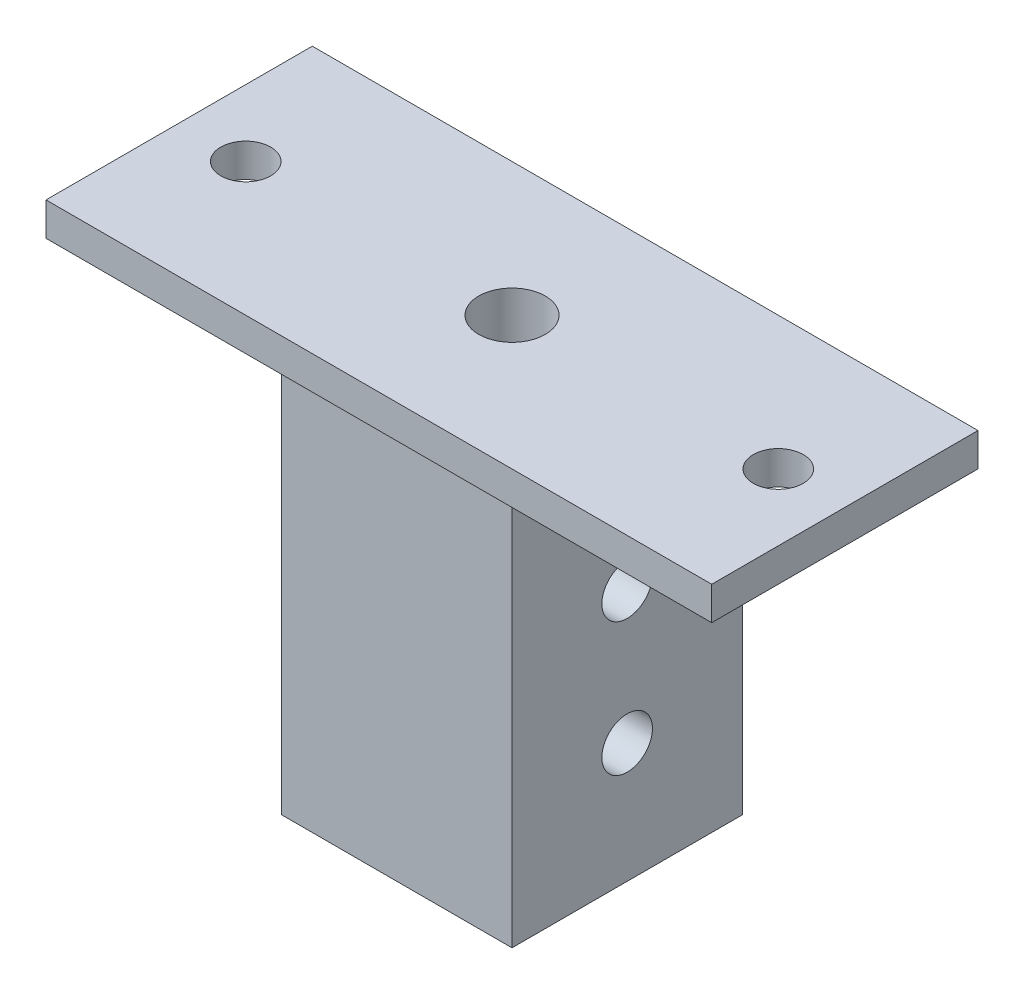
ISO-10303-21;
HEADER;
FILE_DESCRIPTION(('STEP AP214'),'2;1');
FILE_NAME('part.step','',(''),(''),'','','');
FILE_SCHEMA(('AUTOMOTIVE_DESIGN { 1 0 10303 214 1 1 1 1 }'));
ENDSEC;
DATA;
#1=APPLICATION_CONTEXT('core data for automotive mechanical design processes');
#2=APPLICATION_PROTOCOL_DEFINITION('international standard','automotive_design',2000,#1);
#3=PRODUCT_CONTEXT('',#1,'mechanical');
#4=PRODUCT('Part','Part','',(#3));
#5=PRODUCT_RELATED_PRODUCT_CATEGORY('part','',(#4));
#6=PRODUCT_DEFINITION_FORMATION('','',#4);
#7=PRODUCT_DEFINITION_CONTEXT('part definition',#1,'design');
#8=PRODUCT_DEFINITION('design','',#6,#7);
#9=PRODUCT_DEFINITION_SHAPE('','',#8);
#10=(LENGTH_UNIT() NAMED_UNIT(*) SI_UNIT(.MILLI.,.METRE.));
#11=(NAMED_UNIT(*) PLANE_ANGLE_UNIT() SI_UNIT($,.RADIAN.));
#12=(NAMED_UNIT(*) SI_UNIT($,.STERADIAN.) SOLID_ANGLE_UNIT());
#13=UNCERTAINTY_MEASURE_WITH_UNIT(LENGTH_MEASURE(1.E-05),#10,'distance_accuracy_value','');
#14=(GEOMETRIC_REPRESENTATION_CONTEXT(3) GLOBAL_UNCERTAINTY_ASSIGNED_CONTEXT((#13)) GLOBAL_UNIT_ASSIGNED_CONTEXT((#10,
#11,#12)) REPRESENTATION_CONTEXT('',''));
#15=CARTESIAN_POINT('',(0.,0.,0.));
#16=DIRECTION('',(0.,0.,1.));
#17=DIRECTION('',(1.,0.,0.));
#18=AXIS2_PLACEMENT_3D('',#15,#16,#17);
#19=CARTESIAN_POINT('',(0.,26.035,0.));
#20=DIRECTION('',(0.,1.,0.));
#21=DIRECTION('',(0.,0.,1.));
#22=AXIS2_PLACEMENT_3D('',#19,#20,#21);
#23=PLANE('',#22);
#24=DIRECTION('',(1.,0.,0.));
#25=VECTOR('',#24,1.);
#26=CARTESIAN_POINT('',(-14.4145,26.035,1.48106178129071));
#27=LINE('',#26,#25);
#28=CARTESIAN_POINT('',(-2.80839473721199,26.035,1.48106178129071));
#29=VERTEX_POINT('',#28);
#30=CARTESIAN_POINT('',(2.80839473721199,26.035,1.48106178129071));
#31=VERTEX_POINT('',#30);
#32=EDGE_CURVE('E11',#29,#31,#27,.T.);
#33=ORIENTED_EDGE('',*,*,#32,.F.);
#34=CARTESIAN_POINT('',(0.,26.035,0.));
#35=DIRECTION('',(0.,1.,0.));
#36=DIRECTION('',(0.,0.,1.));
#37=AXIS2_PLACEMENT_3D('',#34,#35,#36);
#38=CIRCLE('',#37,3.175);
#39=EDGE_CURVE('E139',#29,#31,#38,.T.);
#40=ORIENTED_EDGE('',*,*,#39,.T.);
#41=EDGE_LOOP('',(#33,#40));
#42=FACE_BOUND('',#41,.T.);
#43=ADVANCED_FACE('F37',(#42),#23,.T.);
#44=CARTESIAN_POINT('',(10.9855,38.1,-10.9855));
#45=DIRECTION('',(-1.,0.,0.));
#46=DIRECTION('',(0.,0.,1.));
#47=AXIS2_PLACEMENT_3D('',#44,#45,#46);
#48=PLANE('',#47);
#49=CARTESIAN_POINT('',(10.9855,24.13,0.));
#50=DIRECTION('',(1.,0.,0.));
#51=DIRECTION('',(0.,0.,-1.));
#52=AXIS2_PLACEMENT_3D('',#49,#50,#51);
#53=CIRCLE('',#52,2.413);
#54=CARTESIAN_POINT('',(10.9855,24.13,-2.413));
#55=VERTEX_POINT('',#54);
#56=EDGE_CURVE('E556',#55,#55,#53,.T.);
#57=ORIENTED_EDGE('',*,*,#56,.F.);
#58=EDGE_LOOP('',(#57));
#59=FACE_BOUND('',#58,.T.);
#60=CARTESIAN_POINT('',(10.9855,11.43,0.));
#61=DIRECTION('',(1.,0.,0.));
#62=DIRECTION('',(0.,0.,-1.));
#63=AXIS2_PLACEMENT_3D('',#60,#61,#62);
#64=CIRCLE('',#63,2.413);
#65=CARTESIAN_POINT('',(10.9855,11.43,-2.413));
#66=VERTEX_POINT('',#65);
#67=EDGE_CURVE('E357',#66,#66,#64,.T.);
#68=ORIENTED_EDGE('',*,*,#67,.F.);
#69=EDGE_LOOP('',(#68));
#70=FACE_BOUND('',#69,.T.);
#71=DIRECTION('',(0.,-1.,0.));
#72=VECTOR('',#71,1.);
#73=CARTESIAN_POINT('',(10.9855,38.1,-10.9855));
#74=LINE('',#73,#72);
#75=CARTESIAN_POINT('',(10.9855,36.83,-10.9855));
#76=VERTEX_POINT('',#75);
#77=CARTESIAN_POINT('',(10.9855,0.,-10.9855));
#78=VERTEX_POINT('',#77);
#79=EDGE_CURVE('E213',#76,#78,#74,.T.);
#80=ORIENTED_EDGE('',*,*,#79,.F.);
#81=DIRECTION('',(0.,0.,-1.));
#82=VECTOR('',#81,1.);
#83=CARTESIAN_POINT('',(10.9855,36.83,10.9855));
#84=LINE('',#83,#82);
#85=CARTESIAN_POINT('',(10.9855,36.83,10.9855));
#86=VERTEX_POINT('',#85);
#87=EDGE_CURVE('E60',#76,#86,#84,.F.);
#88=ORIENTED_EDGE('',*,*,#87,.T.);
#89=DIRECTION('',(0.,-1.,0.));
#90=VECTOR('',#89,1.);
#91=CARTESIAN_POINT('',(10.9855,38.1,10.9855));
#92=LINE('',#91,#90);
#93=CARTESIAN_POINT('',(10.9855,0.,10.9855));
#94=VERTEX_POINT('',#93);
#95=EDGE_CURVE('E207',#86,#94,#92,.T.);
#96=ORIENTED_EDGE('',*,*,#95,.T.);
#97=DIRECTION('',(0.,0.,-1.));
#98=VECTOR('',#97,1.);
#99=CARTESIAN_POINT('',(10.9855,0.,-10.9855));
#100=LINE('',#99,#98);
#101=EDGE_CURVE('E195',#94,#78,#100,.T.);
#102=ORIENTED_EDGE('',*,*,#101,.T.);
#103=EDGE_LOOP('',(#80,#88,#96,#102));
#104=FACE_BOUND('',#103,.T.);
#105=ADVANCED_FACE('F259',(#59,#70,#104),#48,.F.);
#106=CARTESIAN_POINT('',(-10.9855,38.1,-10.9855));
#107=DIRECTION('',(0.,0.,1.));
#108=DIRECTION('',(1.,0.,0.));
#109=AXIS2_PLACEMENT_3D('',#106,#107,#108);
#110=PLANE('',#109);
#111=DIRECTION('',(0.,-1.,0.));
#112=VECTOR('',#111,1.);
#113=CARTESIAN_POINT('',(-10.9855,38.1,-10.9855));
#114=LINE('',#113,#112);
#115=CARTESIAN_POINT('',(-10.9855,36.83,-10.9855));
#116=VERTEX_POINT('',#115);
#117=CARTESIAN_POINT('',(-10.9855,0.,-10.9855));
#118=VERTEX_POINT('',#117);
#119=EDGE_CURVE('E211',#116,#118,#114,.T.);
#120=ORIENTED_EDGE('',*,*,#119,.F.);
#121=DIRECTION('',(-1.,0.,0.));
#122=VECTOR('',#121,1.);
#123=CARTESIAN_POINT('',(10.9855,36.83,-10.9855));
#124=LINE('',#123,#122);
#125=EDGE_CURVE('E224',#116,#76,#124,.F.);
#126=ORIENTED_EDGE('',*,*,#125,.T.);
#127=ORIENTED_EDGE('',*,*,#79,.T.);
#128=DIRECTION('',(-1.,0.,0.));
#129=VECTOR('',#128,1.);
#130=CARTESIAN_POINT('',(-10.9855,0.,-10.9855));
#131=LINE('',#130,#129);
#132=EDGE_CURVE('E198',#78,#118,#131,.T.);
#133=ORIENTED_EDGE('',*,*,#132,.T.);
#134=EDGE_LOOP('',(#120,#126,#127,#133));
#135=FACE_BOUND('',#134,.T.);
#136=ADVANCED_FACE('F261',(#135),#110,.F.);
#137=CARTESIAN_POINT('',(-10.9855,38.1,-10.9855));
#138=DIRECTION('',(1.,0.,0.));
#139=DIRECTION('',(0.,0.,-1.));
#140=AXIS2_PLACEMENT_3D('',#137,#138,#139);
#141=PLANE('',#140);
#142=CARTESIAN_POINT('',(-10.9855,24.13,0.));
#143=DIRECTION('',(1.,0.,0.));
#144=DIRECTION('',(0.,0.,-1.));
#145=AXIS2_PLACEMENT_3D('',#142,#143,#144);
#146=CIRCLE('',#145,2.413);
#147=CARTESIAN_POINT('',(-10.9855,24.13,-2.413));
#148=VERTEX_POINT('',#147);
#149=EDGE_CURVE('E140',#148,#148,#146,.T.);
#150=ORIENTED_EDGE('',*,*,#149,.T.);
#151=EDGE_LOOP('',(#150));
#152=FACE_BOUND('',#151,.T.);
#153=CARTESIAN_POINT('',(-10.9855,11.43,0.));
#154=DIRECTION('',(1.,0.,0.));
#155=DIRECTION('',(0.,0.,-1.));
#156=AXIS2_PLACEMENT_3D('',#153,#154,#155);
#157=CIRCLE('',#156,2.413);
#158=CARTESIAN_POINT('',(-10.9855,11.43,-2.413));
#159=VERTEX_POINT('',#158);
#160=EDGE_CURVE('E41',#159,#159,#157,.T.);
#161=ORIENTED_EDGE('',*,*,#160,.T.);
#162=EDGE_LOOP('',(#161));
#163=FACE_BOUND('',#162,.T.);
#164=DIRECTION('',(0.,-1.,0.));
#165=VECTOR('',#164,1.);
#166=CARTESIAN_POINT('',(-10.9855,38.1,10.9855));
#167=LINE('',#166,#165);
#168=CARTESIAN_POINT('',(-10.9855,36.83,10.9855));
#169=VERTEX_POINT('',#168);
#170=CARTESIAN_POINT('',(-10.9855,0.,10.9855));
#171=VERTEX_POINT('',#170);
#172=EDGE_CURVE('E209',#169,#171,#167,.T.);
#173=ORIENTED_EDGE('',*,*,#172,.F.);
#174=DIRECTION('',(0.,0.,1.));
#175=VECTOR('',#174,1.);
#176=CARTESIAN_POINT('',(-10.9855,36.83,-10.9855));
#177=LINE('',#176,#175);
#178=EDGE_CURVE('E227',#169,#116,#177,.F.);
#179=ORIENTED_EDGE('',*,*,#178,.T.);
#180=ORIENTED_EDGE('',*,*,#119,.T.);
#181=DIRECTION('',(0.,0.,1.));
#182=VECTOR('',#181,1.);
#183=CARTESIAN_POINT('',(-10.9855,0.,-10.9855));
#184=LINE('',#183,#182);
#185=EDGE_CURVE('E201',#118,#171,#184,.T.);
#186=ORIENTED_EDGE('',*,*,#185,.T.);
#187=EDGE_LOOP('',(#173,#179,#180,#186));
#188=FACE_BOUND('',#187,.T.);
#189=ADVANCED_FACE('F251',(#152,#163,#188),#141,.F.);
#190=CARTESIAN_POINT('',(-10.9855,38.1,10.9855));
#191=DIRECTION('',(0.,0.,-1.));
#192=DIRECTION('',(-1.,0.,0.));
#193=AXIS2_PLACEMENT_3D('',#190,#191,#192);
#194=PLANE('',#193);
#195=ORIENTED_EDGE('',*,*,#95,.F.);
#196=DIRECTION('',(1.,0.,0.));
#197=VECTOR('',#196,1.);
#198=CARTESIAN_POINT('',(-10.9855,36.83,10.9855));
#199=LINE('',#198,#197);
#200=EDGE_CURVE('E229',#86,#169,#199,.F.);
#201=ORIENTED_EDGE('',*,*,#200,.T.);
#202=ORIENTED_EDGE('',*,*,#172,.T.);
#203=DIRECTION('',(1.,0.,0.));
#204=VECTOR('',#203,1.);
#205=CARTESIAN_POINT('',(-10.9855,0.,10.9855));
#206=LINE('',#205,#204);
#207=EDGE_CURVE('E204',#171,#94,#206,.T.);
#208=ORIENTED_EDGE('',*,*,#207,.T.);
#209=EDGE_LOOP('',(#195,#201,#202,#208));
#210=FACE_BOUND('',#209,.T.);
#211=ADVANCED_FACE('F249',(#210),#194,.F.);
#212=CARTESIAN_POINT('',(0.,0.,0.));
#213=DIRECTION('',(0.,1.,0.));
#214=DIRECTION('',(0.,0.,1.));
#215=AXIS2_PLACEMENT_3D('',#212,#213,#214);
#216=PLANE('',#215);
#217=ORIENTED_EDGE('',*,*,#101,.F.);
#218=ORIENTED_EDGE('',*,*,#207,.F.);
#219=ORIENTED_EDGE('',*,*,#185,.F.);
#220=ORIENTED_EDGE('',*,*,#132,.F.);
#221=EDGE_LOOP('',(#217,#218,#219,#220));
#222=FACE_BOUND('',#221,.T.);
#223=ADVANCED_FACE('F258',(#222),#216,.F.);
#224=CARTESIAN_POINT('',(0.,38.1,0.));
#225=DIRECTION('',(0.,1.,0.));
#226=DIRECTION('',(0.,0.,1.));
#227=AXIS2_PLACEMENT_3D('',#224,#225,#226);
#228=PLANE('',#227);
#229=DIRECTION('',(0.,0.,-1.));
#230=VECTOR('',#229,1.);
#231=CARTESIAN_POINT('',(12.2555,38.1,-10.9855));
#232=LINE('',#231,#230);
#233=CARTESIAN_POINT('',(12.2555,38.1,12.2555));
#234=VERTEX_POINT('',#233);
#235=CARTESIAN_POINT('',(12.2555,38.1,-12.2555));
#236=VERTEX_POINT('',#235);
#237=EDGE_CURVE('E215',#234,#236,#232,.T.);
#238=ORIENTED_EDGE('',*,*,#237,.T.);
#239=DIRECTION('',(-1.,0.,0.));
#240=VECTOR('',#239,1.);
#241=CARTESIAN_POINT('',(-10.9855,38.1,-12.2555));
#242=LINE('',#241,#240);
#243=CARTESIAN_POINT('',(-12.2555,38.1,-12.2555));
#244=VERTEX_POINT('',#243);
#245=EDGE_CURVE('E221',#236,#244,#242,.T.);
#246=ORIENTED_EDGE('',*,*,#245,.T.);
#247=DIRECTION('',(0.,0.,1.));
#248=VECTOR('',#247,1.);
#249=CARTESIAN_POINT('',(-12.2555,38.1,10.9855));
#250=LINE('',#249,#248);
#251=CARTESIAN_POINT('',(-12.2555,38.1,12.2555));
#252=VERTEX_POINT('',#251);
#253=EDGE_CURVE('E219',#244,#252,#250,.T.);
#254=ORIENTED_EDGE('',*,*,#253,.T.);
#255=DIRECTION('',(1.,0.,0.));
#256=VECTOR('',#255,1.);
#257=CARTESIAN_POINT('',(10.9855,38.1,12.2555));
#258=LINE('',#257,#256);
#259=EDGE_CURVE('E217',#252,#234,#258,.T.);
#260=ORIENTED_EDGE('',*,*,#259,.T.);
#261=EDGE_LOOP('',(#238,#246,#254,#260));
#262=FACE_BOUND('',#261,.T.);
#263=CARTESIAN_POINT('',(25.4,38.1,0.));
#264=DIRECTION('',(0.,1.,0.));
#265=DIRECTION('',(0.,0.,1.));
#266=AXIS2_PLACEMENT_3D('',#263,#264,#265);
#267=CIRCLE('',#266,2.38125);
#268=CARTESIAN_POINT('',(25.4,38.1,2.38125));
#269=VERTEX_POINT('',#268);
#270=EDGE_CURVE('E152',#269,#269,#267,.T.);
#271=ORIENTED_EDGE('',*,*,#270,.T.);
#272=EDGE_LOOP('',(#271));
#273=FACE_BOUND('',#272,.T.);
#274=CARTESIAN_POINT('',(-25.4,38.1,0.));
#275=DIRECTION('',(0.,1.,0.));
#276=DIRECTION('',(0.,0.,1.));
#277=AXIS2_PLACEMENT_3D('',#274,#275,#276);
#278=CIRCLE('',#277,2.38125);
#279=CARTESIAN_POINT('',(-25.4,38.1,2.38125));
#280=VERTEX_POINT('',#279);
#281=EDGE_CURVE('E162',#280,#280,#278,.T.);
#282=ORIENTED_EDGE('',*,*,#281,.T.);
#283=EDGE_LOOP('',(#282));
#284=FACE_BOUND('',#283,.T.);
#285=DIRECTION('',(0.,0.,-1.));
#286=VECTOR('',#285,1.);
#287=CARTESIAN_POINT('',(31.75,38.1,-12.7));
#288=LINE('',#287,#286);
#289=CARTESIAN_POINT('',(31.75,38.1,12.7));
#290=VERTEX_POINT('',#289);
#291=CARTESIAN_POINT('',(31.75,38.1,-12.7));
#292=VERTEX_POINT('',#291);
#293=EDGE_CURVE('E155',#290,#292,#288,.T.);
#294=ORIENTED_EDGE('',*,*,#293,.F.);
#295=DIRECTION('',(1.,0.,0.));
#296=VECTOR('',#295,1.);
#297=CARTESIAN_POINT('',(-31.75,38.1,12.7));
#298=LINE('',#297,#296);
#299=CARTESIAN_POINT('',(-31.75,38.1,12.7));
#300=VERTEX_POINT('',#299);
#301=EDGE_CURVE('E170',#300,#290,#298,.T.);
#302=ORIENTED_EDGE('',*,*,#301,.F.);
#303=DIRECTION('',(0.,0.,1.));
#304=VECTOR('',#303,1.);
#305=CARTESIAN_POINT('',(-31.75,38.1,-12.7));
#306=LINE('',#305,#304);
#307=CARTESIAN_POINT('',(-31.75,38.1,-12.7));
#308=VERTEX_POINT('',#307);
#309=EDGE_CURVE('E181',#308,#300,#306,.T.);
#310=ORIENTED_EDGE('',*,*,#309,.F.);
#311=DIRECTION('',(-1.,0.,0.));
#312=VECTOR('',#311,1.);
#313=CARTESIAN_POINT('',(-31.75,38.1,-12.7));
#314=LINE('',#313,#312);
#315=EDGE_CURVE('E179',#292,#308,#314,.T.);
#316=ORIENTED_EDGE('',*,*,#315,.F.);
#317=EDGE_LOOP('',(#294,#302,#310,#316));
#318=FACE_BOUND('',#317,.T.);
#319=ADVANCED_FACE('F271',(#262,#273,#284,#318),#228,.F.);
#320=CARTESIAN_POINT('',(31.75,41.275,-12.7));
#321=DIRECTION('',(-1.,0.,0.));
#322=DIRECTION('',(0.,0.,1.));
#323=AXIS2_PLACEMENT_3D('',#320,#321,#322);
#324=PLANE('',#323);
#325=ORIENTED_EDGE('',*,*,#293,.T.);
#326=DIRECTION('',(0.,-1.,0.));
#327=VECTOR('',#326,1.);
#328=CARTESIAN_POINT('',(31.75,41.275,-12.7));
#329=LINE('',#328,#327);
#330=CARTESIAN_POINT('',(31.75,41.275,-12.7));
#331=VERTEX_POINT('',#330);
#332=EDGE_CURVE('E192',#331,#292,#329,.T.);
#333=ORIENTED_EDGE('',*,*,#332,.F.);
#334=DIRECTION('',(0.,0.,-1.));
#335=VECTOR('',#334,1.);
#336=CARTESIAN_POINT('',(31.75,41.275,-12.7));
#337=LINE('',#336,#335);
#338=CARTESIAN_POINT('',(31.75,41.275,12.7));
#339=VERTEX_POINT('',#338);
#340=EDGE_CURVE('E166',#339,#331,#337,.T.);
#341=ORIENTED_EDGE('',*,*,#340,.F.);
#342=DIRECTION('',(0.,-1.,0.));
#343=VECTOR('',#342,1.);
#344=CARTESIAN_POINT('',(31.75,41.275,12.7));
#345=LINE('',#344,#343);
#346=EDGE_CURVE('E176',#339,#290,#345,.T.);
#347=ORIENTED_EDGE('',*,*,#346,.T.);
#348=EDGE_LOOP('',(#325,#333,#341,#347));
#349=FACE_BOUND('',#348,.T.);
#350=ADVANCED_FACE('F274',(#349),#324,.F.);
#351=CARTESIAN_POINT('',(-31.75,41.275,-12.7));
#352=DIRECTION('',(0.,0.,1.));
#353=DIRECTION('',(1.,0.,0.));
#354=AXIS2_PLACEMENT_3D('',#351,#352,#353);
#355=PLANE('',#354);
#356=ORIENTED_EDGE('',*,*,#315,.T.);
#357=DIRECTION('',(0.,-1.,0.));
#358=VECTOR('',#357,1.);
#359=CARTESIAN_POINT('',(-31.75,41.275,-12.7));
#360=LINE('',#359,#358);
#361=CARTESIAN_POINT('',(-31.75,41.275,-12.7));
#362=VERTEX_POINT('',#361);
#363=EDGE_CURVE('E189',#362,#308,#360,.T.);
#364=ORIENTED_EDGE('',*,*,#363,.F.);
#365=DIRECTION('',(-1.,0.,0.));
#366=VECTOR('',#365,1.);
#367=CARTESIAN_POINT('',(-31.75,41.275,-12.7));
#368=LINE('',#367,#366);
#369=EDGE_CURVE('E169',#331,#362,#368,.T.);
#370=ORIENTED_EDGE('',*,*,#369,.F.);
#371=ORIENTED_EDGE('',*,*,#332,.T.);
#372=EDGE_LOOP('',(#356,#364,#370,#371));
#373=FACE_BOUND('',#372,.T.);
#374=ADVANCED_FACE('F296',(#373),#355,.F.);
#375=CARTESIAN_POINT('',(-31.75,41.275,-12.7));
#376=DIRECTION('',(1.,0.,0.));
#377=DIRECTION('',(0.,0.,-1.));
#378=AXIS2_PLACEMENT_3D('',#375,#376,#377);
#379=PLANE('',#378);
#380=ORIENTED_EDGE('',*,*,#309,.T.);
#381=DIRECTION('',(0.,-1.,0.));
#382=VECTOR('',#381,1.);
#383=CARTESIAN_POINT('',(-31.75,41.275,12.7));
#384=LINE('',#383,#382);
#385=CARTESIAN_POINT('',(-31.75,41.275,12.7));
#386=VERTEX_POINT('',#385);
#387=EDGE_CURVE('E186',#386,#300,#384,.T.);
#388=ORIENTED_EDGE('',*,*,#387,.F.);
#389=DIRECTION('',(0.,0.,1.));
#390=VECTOR('',#389,1.);
#391=CARTESIAN_POINT('',(-31.75,41.275,-12.7));
#392=LINE('',#391,#390);
#393=EDGE_CURVE('E172',#362,#386,#392,.T.);
#394=ORIENTED_EDGE('',*,*,#393,.F.);
#395=ORIENTED_EDGE('',*,*,#363,.T.);
#396=EDGE_LOOP('',(#380,#388,#394,#395));
#397=FACE_BOUND('',#396,.T.);
#398=ADVANCED_FACE('F293',(#397),#379,.F.);
#399=CARTESIAN_POINT('',(-31.75,41.275,12.7));
#400=DIRECTION('',(0.,0.,-1.));
#401=DIRECTION('',(-1.,0.,0.));
#402=AXIS2_PLACEMENT_3D('',#399,#400,#401);
#403=PLANE('',#402);
#404=ORIENTED_EDGE('',*,*,#301,.T.);
#405=ORIENTED_EDGE('',*,*,#346,.F.);
#406=DIRECTION('',(1.,0.,0.));
#407=VECTOR('',#406,1.);
#408=CARTESIAN_POINT('',(-31.75,41.275,12.7));
#409=LINE('',#408,#407);
#410=EDGE_CURVE('E174',#386,#339,#409,.T.);
#411=ORIENTED_EDGE('',*,*,#410,.F.);
#412=ORIENTED_EDGE('',*,*,#387,.T.);
#413=EDGE_LOOP('',(#404,#405,#411,#412));
#414=FACE_BOUND('',#413,.T.);
#415=ADVANCED_FACE('F289',(#414),#403,.F.);
#416=CARTESIAN_POINT('',(0.,41.275,0.));
#417=DIRECTION('',(0.,1.,0.));
#418=DIRECTION('',(0.,0.,1.));
#419=AXIS2_PLACEMENT_3D('',#416,#417,#418);
#420=PLANE('',#419);
#421=CARTESIAN_POINT('',(0.,41.275,0.));
#422=DIRECTION('',(0.,1.,0.));
#423=DIRECTION('',(0.,0.,1.));
#424=AXIS2_PLACEMENT_3D('',#421,#422,#423);
#425=CIRCLE('',#424,3.175);
#426=CARTESIAN_POINT('',(0.,41.275,3.175));
#427=VERTEX_POINT('',#426);
#428=EDGE_CURVE('E147',#427,#427,#425,.T.);
#429=ORIENTED_EDGE('',*,*,#428,.F.);
#430=EDGE_LOOP('',(#429));
#431=FACE_BOUND('',#430,.T.);
#432=CARTESIAN_POINT('',(25.4,41.275,0.));
#433=DIRECTION('',(0.,1.,0.));
#434=DIRECTION('',(0.,0.,1.));
#435=AXIS2_PLACEMENT_3D('',#432,#433,#434);
#436=CIRCLE('',#435,2.38125);
#437=CARTESIAN_POINT('',(25.4,41.275,2.38125));
#438=VERTEX_POINT('',#437);
#439=EDGE_CURVE('E156',#438,#438,#436,.T.);
#440=ORIENTED_EDGE('',*,*,#439,.F.);
#441=EDGE_LOOP('',(#440));
#442=FACE_BOUND('',#441,.T.);
#443=CARTESIAN_POINT('',(-25.4,41.275,0.));
#444=DIRECTION('',(0.,1.,0.));
#445=DIRECTION('',(0.,0.,1.));
#446=AXIS2_PLACEMENT_3D('',#443,#444,#445);
#447=CIRCLE('',#446,2.38125);
#448=CARTESIAN_POINT('',(-25.4,41.275,2.38125));
#449=VERTEX_POINT('',#448);
#450=EDGE_CURVE('E159',#449,#449,#447,.T.);
#451=ORIENTED_EDGE('',*,*,#450,.F.);
#452=EDGE_LOOP('',(#451));
#453=FACE_BOUND('',#452,.T.);
#454=ORIENTED_EDGE('',*,*,#340,.T.);
#455=ORIENTED_EDGE('',*,*,#369,.T.);
#456=ORIENTED_EDGE('',*,*,#393,.T.);
#457=ORIENTED_EDGE('',*,*,#410,.T.);
#458=EDGE_LOOP('',(#454,#455,#456,#457));
#459=FACE_BOUND('',#458,.T.);
#460=ADVANCED_FACE('F298',(#431,#442,#453,#459),#420,.T.);
#461=CARTESIAN_POINT('',(-25.4,38.1,0.));
#462=DIRECTION('',(0.,1.,0.));
#463=DIRECTION('',(0.,0.,1.));
#464=AXIS2_PLACEMENT_3D('',#461,#462,#463);
#465=CYLINDRICAL_SURFACE('',#464,2.38125);
#466=ORIENTED_EDGE('',*,*,#281,.F.);
#467=EDGE_LOOP('',(#466));
#468=FACE_BOUND('',#467,.T.);
#469=ORIENTED_EDGE('',*,*,#450,.T.);
#470=EDGE_LOOP('',(#469));
#471=FACE_BOUND('',#470,.T.);
#472=ADVANCED_FACE('F300',(#468,#471),#465,.F.);
#473=CARTESIAN_POINT('',(25.4,38.1,0.));
#474=DIRECTION('',(0.,1.,0.));
#475=DIRECTION('',(0.,0.,1.));
#476=AXIS2_PLACEMENT_3D('',#473,#474,#475);
#477=CYLINDRICAL_SURFACE('',#476,2.38125);
#478=ORIENTED_EDGE('',*,*,#270,.F.);
#479=EDGE_LOOP('',(#478));
#480=FACE_BOUND('',#479,.T.);
#481=ORIENTED_EDGE('',*,*,#439,.T.);
#482=EDGE_LOOP('',(#481));
#483=FACE_BOUND('',#482,.T.);
#484=ADVANCED_FACE('F307',(#480,#483),#477,.F.);
#485=CARTESIAN_POINT('',(0.,36.83,12.2555));
#486=DIRECTION('',(-1.,0.,0.));
#487=DIRECTION('',(0.,0.,1.));
#488=AXIS2_PLACEMENT_3D('',#485,#486,#487);
#489=CYLINDRICAL_SURFACE('',#488,1.27);
#490=CARTESIAN_POINT('',(-12.2555,36.83,12.2555));
#491=DIRECTION('',(-0.707106781186548,0.,-0.707106781186547));
#492=DIRECTION('',(-0.707106781186547,0.,0.707106781186548));
#493=AXIS2_PLACEMENT_3D('',#490,#491,#492);
#494=ELLIPSE('',#493,1.79605122421383,1.27);
#495=EDGE_CURVE('E233',#169,#252,#494,.F.);
#496=ORIENTED_EDGE('',*,*,#495,.F.);
#497=ORIENTED_EDGE('',*,*,#200,.F.);
#498=CARTESIAN_POINT('',(12.2555,36.83,12.2555));
#499=DIRECTION('',(-0.707106781186547,0.,0.707106781186548));
#500=DIRECTION('',(0.707106781186548,0.,0.707106781186547));
#501=AXIS2_PLACEMENT_3D('',#498,#499,#500);
#502=ELLIPSE('',#501,1.79605122421383,1.27);
#503=EDGE_CURVE('E165',#234,#86,#502,.T.);
#504=ORIENTED_EDGE('',*,*,#503,.F.);
#505=ORIENTED_EDGE('',*,*,#259,.F.);
#506=EDGE_LOOP('',(#496,#497,#504,#505));
#507=FACE_BOUND('',#506,.T.);
#508=ADVANCED_FACE('F39',(#507),#489,.F.);
#509=CARTESIAN_POINT('',(12.2555,36.83,0.));
#510=DIRECTION('',(0.,0.,1.));
#511=DIRECTION('',(1.,0.,0.));
#512=AXIS2_PLACEMENT_3D('',#509,#510,#511);
#513=CYLINDRICAL_SURFACE('',#512,1.27);
#514=ORIENTED_EDGE('',*,*,#503,.T.);
#515=ORIENTED_EDGE('',*,*,#87,.F.);
#516=CARTESIAN_POINT('',(12.2555,36.83,-12.2555));
#517=DIRECTION('',(0.707106781186548,0.,0.707106781186547));
#518=DIRECTION('',(-0.707106781186547,0.,0.707106781186548));
#519=AXIS2_PLACEMENT_3D('',#516,#517,#518);
#520=ELLIPSE('',#519,1.79605122421383,1.27);
#521=EDGE_CURVE('E145',#236,#76,#520,.T.);
#522=ORIENTED_EDGE('',*,*,#521,.F.);
#523=ORIENTED_EDGE('',*,*,#237,.F.);
#524=EDGE_LOOP('',(#514,#515,#522,#523));
#525=FACE_BOUND('',#524,.T.);
#526=ADVANCED_FACE('F240',(#525),#513,.F.);
#527=CARTESIAN_POINT('',(-12.2555,36.83,0.));
#528=DIRECTION('',(0.,0.,-1.));
#529=DIRECTION('',(-1.,0.,0.));
#530=AXIS2_PLACEMENT_3D('',#527,#528,#529);
#531=CYLINDRICAL_SURFACE('',#530,1.27);
#532=ORIENTED_EDGE('',*,*,#495,.T.);
#533=ORIENTED_EDGE('',*,*,#253,.F.);
#534=CARTESIAN_POINT('',(-12.2555,36.83,-12.2555));
#535=DIRECTION('',(0.707106781186547,0.,-0.707106781186548));
#536=DIRECTION('',(-0.707106781186548,0.,-0.707106781186547));
#537=AXIS2_PLACEMENT_3D('',#534,#535,#536);
#538=ELLIPSE('',#537,1.79605122421383,1.27);
#539=EDGE_CURVE('E143',#116,#244,#538,.F.);
#540=ORIENTED_EDGE('',*,*,#539,.F.);
#541=ORIENTED_EDGE('',*,*,#178,.F.);
#542=EDGE_LOOP('',(#532,#533,#540,#541));
#543=FACE_BOUND('',#542,.T.);
#544=ADVANCED_FACE('F269',(#543),#531,.F.);
#545=CARTESIAN_POINT('',(0.,36.83,-12.2555));
#546=DIRECTION('',(1.,0.,0.));
#547=DIRECTION('',(0.,0.,-1.));
#548=AXIS2_PLACEMENT_3D('',#545,#546,#547);
#549=CYLINDRICAL_SURFACE('',#548,1.27);
#550=ORIENTED_EDGE('',*,*,#521,.T.);
#551=ORIENTED_EDGE('',*,*,#125,.F.);
#552=ORIENTED_EDGE('',*,*,#539,.T.);
#553=ORIENTED_EDGE('',*,*,#245,.F.);
#554=EDGE_LOOP('',(#550,#551,#552,#553));
#555=FACE_BOUND('',#554,.T.);
#556=ADVANCED_FACE('F265',(#555),#549,.F.);
#557=CARTESIAN_POINT('',(0.,26.035,0.));
#558=DIRECTION('',(0.,1.,0.));
#559=DIRECTION('',(0.,0.,1.));
#560=AXIS2_PLACEMENT_3D('',#557,#558,#559);
#561=CYLINDRICAL_SURFACE('',#560,3.175);
#562=ORIENTED_EDGE('',*,*,#39,.F.);
#563=CARTESIAN_POINT('',(-2.80839473721199,26.035,1.48106178129071));
#564=CARTESIAN_POINT('',(-2.83283897514701,26.0710300346145,1.43470865549221));
#565=CARTESIAN_POINT('',(-2.85661630803426,26.1055380049939,1.38683953476424));
#566=CARTESIAN_POINT('',(-2.90248686165632,26.1713071911288,1.28808676211939));
#567=CARTESIAN_POINT('',(-2.92457854112813,26.202565444778,1.23720042521245));
#568=CARTESIAN_POINT('',(-2.98798666933941,26.2914217237591,1.07954275850011));
#569=CARTESIAN_POINT('',(-3.02613307233286,26.3436619913393,0.968331586545838));
#570=CARTESIAN_POINT('',(-3.0909938521232,26.4315365463995,0.735563529873273));
#571=CARTESIAN_POINT('',(-3.11764244189276,26.4670753738338,0.613951758603757));
#572=CARTESIAN_POINT('',(-3.15647822479542,26.5186379164269,0.364777228967862));
#573=CARTESIAN_POINT('',(-3.16871807060362,26.5347326900719,0.237237919093362));
#574=CARTESIAN_POINT('',(-3.17704024613099,26.5456849629036,-0.0047423175003183));
#575=CARTESIAN_POINT('',(-3.17479392177454,26.5427391745206,-0.119032651963973));
#576=CARTESIAN_POINT('',(-3.15821033763072,26.5208760213716,-0.345248564184393));
#577=CARTESIAN_POINT('',(-3.14386461771983,26.5019474811563,-0.457172431116865));
#578=CARTESIAN_POINT('',(-3.10510723759182,26.4503255296127,-0.671042064402887));
#579=CARTESIAN_POINT('',(-3.08111797577182,26.4182086489646,-0.773207575834493));
#580=CARTESIAN_POINT('',(-3.02479875650562,26.3417908114135,-0.97043254199856));
#581=CARTESIAN_POINT('',(-2.99246593850312,26.2974856754691,-1.06548954516144));
#582=CARTESIAN_POINT('',(-2.93438649235434,26.2163966968841,-1.21402217899341));
#583=CARTESIAN_POINT('',(-2.91053928515269,26.182764066604,-1.2700178365541));
#584=CARTESIAN_POINT('',(-2.86085085891519,26.1116776874377,-1.37829404894055));
#585=CARTESIAN_POINT('',(-2.83501655639569,26.0742370584057,-1.4305863727821));
#586=CARTESIAN_POINT('',(-2.80839473721199,26.035,-1.48106178129071));
#587=B_SPLINE_CURVE_WITH_KNOTS('',3,(#563,#564,#565,#566,#567,#568,#569,#570,#571,#572,#573,
#574,#575,#576,#577,#578,#579,#580,#581,#582,#583,#584,#585,#586),.UNSPECIFIED.,.F.,.F.,(4,2,2,
2,2,2,2,2,2,2,2,4),(0.,0.190706970473101,0.381586273174426,0.765638809562113,1.1518605419094,
1.53666651153908,1.87793660719808,2.21944552330275,2.54739134139116,2.87544974417515,
3.08384705507103,3.29154923966892),.UNSPECIFIED.);
#588=CARTESIAN_POINT('',(-2.80839473721199,26.035,-1.48106178129071));
#589=VERTEX_POINT('',#588);
#590=EDGE_CURVE('E127',#29,#589,#587,.T.);
#591=ORIENTED_EDGE('',*,*,#590,.T.);
#592=CARTESIAN_POINT('',(2.80839473721199,26.035,-1.48106178129071));
#593=VERTEX_POINT('',#592);
#594=EDGE_CURVE('E137',#593,#589,#38,.T.);
#595=ORIENTED_EDGE('',*,*,#594,.F.);
#596=CARTESIAN_POINT('',(2.80839473721199,26.035,-1.48106178129071));
#597=CARTESIAN_POINT('',(2.83283897514701,26.0710300346145,-1.43470865549221));
#598=CARTESIAN_POINT('',(2.85661630803426,26.1055380049939,-1.38683953476424));
#599=CARTESIAN_POINT('',(2.90248686165632,26.1713071911288,-1.28808676211939));
#600=CARTESIAN_POINT('',(2.92457854112813,26.202565444778,-1.23720042521245));
#601=CARTESIAN_POINT('',(2.98798666933941,26.2914217237591,-1.07954275850011));
#602=CARTESIAN_POINT('',(3.02613307233286,26.3436619913393,-0.968331586545837));
#603=CARTESIAN_POINT('',(3.0909938521232,26.4315365463995,-0.735563529873273));
#604=CARTESIAN_POINT('',(3.11764244189276,26.4670753738338,-0.613951758603756));
#605=CARTESIAN_POINT('',(3.15647822479542,26.5186379164269,-0.364777228967861));
#606=CARTESIAN_POINT('',(3.16871807060362,26.5347326900719,-0.237237919093361));
#607=CARTESIAN_POINT('',(3.17704024613099,26.5456849629036,0.00474231750031971));
#608=CARTESIAN_POINT('',(3.17479392177454,26.5427391745206,0.119032651963974));
#609=CARTESIAN_POINT('',(3.15821033763072,26.5208760213716,0.345248564184395));
#610=CARTESIAN_POINT('',(3.14386461771983,26.5019474811563,0.457172431116867));
#611=CARTESIAN_POINT('',(3.10510723759182,26.4503255296127,0.671042064402889));
#612=CARTESIAN_POINT('',(3.08111797577182,26.4182086489646,0.773207575834494));
#613=CARTESIAN_POINT('',(3.02479875650562,26.3417908114135,0.970432541998562));
#614=CARTESIAN_POINT('',(2.99246593850312,26.2974856754691,1.06548954516144));
#615=CARTESIAN_POINT('',(2.93438649235434,26.2163966968841,1.21402217899341));
#616=CARTESIAN_POINT('',(2.91053928515269,26.182764066604,1.2700178365541));
#617=CARTESIAN_POINT('',(2.86085085891519,26.1116776874377,1.37829404894055));
#618=CARTESIAN_POINT('',(2.83501655639569,26.0742370584057,1.4305863727821));
#619=CARTESIAN_POINT('',(2.80839473721199,26.035,1.48106178129071));
#620=B_SPLINE_CURVE_WITH_KNOTS('',3,(#596,#597,#598,#599,#600,#601,#602,#603,#604,#605,#606,
#607,#608,#609,#610,#611,#612,#613,#614,#615,#616,#617,#618,#619),.UNSPECIFIED.,.F.,.F.,(4,2,2,
2,2,2,2,2,2,2,2,4),(0.,0.190706970473101,0.381586273174426,0.765638809562114,1.1518605419094,
1.53666651153908,1.87793660719808,2.21944552330276,2.54739134139116,2.87544974417515,
3.08384705507103,3.29154923966892),.UNSPECIFIED.);
#621=EDGE_CURVE('E52',#593,#31,#620,.T.);
#622=ORIENTED_EDGE('',*,*,#621,.T.);
#623=EDGE_LOOP('',(#562,#591,#595,#622));
#624=FACE_BOUND('',#623,.T.);
#625=ORIENTED_EDGE('',*,*,#428,.T.);
#626=EDGE_LOOP('',(#625));
#627=FACE_BOUND('',#626,.T.);
#628=ADVANCED_FACE('F135',(#624,#627),#561,.F.);
#629=DIRECTION('',(1.,0.,0.));
#630=VECTOR('',#629,1.);
#631=CARTESIAN_POINT('',(-14.4145,26.035,-1.4810617812907));
#632=LINE('',#631,#630);
#633=EDGE_CURVE('E46',#593,#589,#632,.F.);
#634=ORIENTED_EDGE('',*,*,#633,.F.);
#635=ORIENTED_EDGE('',*,*,#594,.T.);
#636=EDGE_LOOP('',(#634,#635));
#637=FACE_BOUND('',#636,.T.);
#638=ADVANCED_FACE('F142',(#637),#23,.T.);
#639=CARTESIAN_POINT('',(-14.4145,24.13,0.));
#640=DIRECTION('',(1.,0.,0.));
#641=DIRECTION('',(0.,0.,-1.));
#642=AXIS2_PLACEMENT_3D('',#639,#640,#641);
#643=CYLINDRICAL_SURFACE('',#642,2.413);
#644=ORIENTED_EDGE('',*,*,#56,.T.);
#645=EDGE_LOOP('',(#644));
#646=FACE_BOUND('',#645,.T.);
#647=ORIENTED_EDGE('',*,*,#32,.T.);
#648=ORIENTED_EDGE('',*,*,#621,.F.);
#649=ORIENTED_EDGE('',*,*,#633,.T.);
#650=ORIENTED_EDGE('',*,*,#590,.F.);
#651=EDGE_LOOP('',(#647,#648,#649,#650));
#652=FACE_BOUND('',#651,.T.);
#653=ORIENTED_EDGE('',*,*,#149,.F.);
#654=EDGE_LOOP('',(#653));
#655=FACE_BOUND('',#654,.T.);
#656=ADVANCED_FACE('F125',(#646,#652,#655),#643,.F.);
#657=CARTESIAN_POINT('',(-14.4145,11.43,0.));
#658=DIRECTION('',(1.,0.,0.));
#659=DIRECTION('',(0.,0.,-1.));
#660=AXIS2_PLACEMENT_3D('',#657,#658,#659);
#661=CYLINDRICAL_SURFACE('',#660,2.413);
#662=ORIENTED_EDGE('',*,*,#67,.T.);
#663=EDGE_LOOP('',(#662));
#664=FACE_BOUND('',#663,.T.);
#665=ORIENTED_EDGE('',*,*,#160,.F.);
#666=EDGE_LOOP('',(#665));
#667=FACE_BOUND('',#666,.T.);
#668=ADVANCED_FACE('F328',(#664,#667),#661,.F.);
#669=CLOSED_SHELL('',(#43,#105,#136,#189,#211,#223,#319,#350,#374,#398,#415,#460,#472,#484,#508,
#526,#544,#556,#628,#638,#656,#668));
#670=MANIFOLD_SOLID_BREP('B2',#669);
#671=ADVANCED_BREP_SHAPE_REPRESENTATION('',(#18,#670),#14);
#672=SHAPE_DEFINITION_REPRESENTATION(#9,#671);
ENDSEC;
END-ISO-10303-21;
